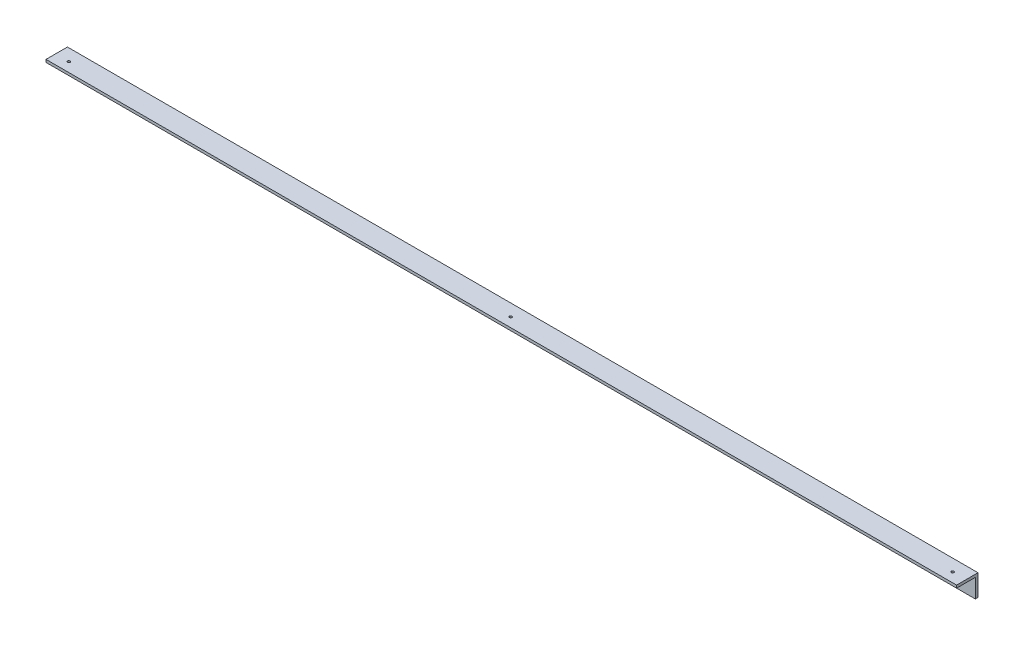
ISO-10303-21;
HEADER;
FILE_DESCRIPTION(('STEP AP214'),'2;1');
FILE_NAME('part.step','',(''),(''),'','','');
FILE_SCHEMA(('AUTOMOTIVE_DESIGN { 1 0 10303 214 1 1 1 1 }'));
ENDSEC;
DATA;
#1=APPLICATION_CONTEXT('core data for automotive mechanical design processes');
#2=APPLICATION_PROTOCOL_DEFINITION('international standard','automotive_design',2000,#1);
#3=PRODUCT_CONTEXT('',#1,'mechanical');
#4=PRODUCT('Part','Part','',(#3));
#5=PRODUCT_RELATED_PRODUCT_CATEGORY('part','',(#4));
#6=PRODUCT_DEFINITION_FORMATION('','',#4);
#7=PRODUCT_DEFINITION_CONTEXT('part definition',#1,'design');
#8=PRODUCT_DEFINITION('design','',#6,#7);
#9=PRODUCT_DEFINITION_SHAPE('','',#8);
#10=(LENGTH_UNIT() NAMED_UNIT(*) SI_UNIT(.MILLI.,.METRE.));
#11=(NAMED_UNIT(*) PLANE_ANGLE_UNIT() SI_UNIT($,.RADIAN.));
#12=(NAMED_UNIT(*) SI_UNIT($,.STERADIAN.) SOLID_ANGLE_UNIT());
#13=UNCERTAINTY_MEASURE_WITH_UNIT(LENGTH_MEASURE(1.E-05),#10,'distance_accuracy_value','');
#14=(GEOMETRIC_REPRESENTATION_CONTEXT(3) GLOBAL_UNCERTAINTY_ASSIGNED_CONTEXT((#13)) GLOBAL_UNIT_ASSIGNED_CONTEXT((#10,
#11,#12)) REPRESENTATION_CONTEXT('',''));
#15=CARTESIAN_POINT('',(0.,0.,0.));
#16=DIRECTION('',(0.,0.,1.));
#17=DIRECTION('',(1.,0.,0.));
#18=AXIS2_PLACEMENT_3D('',#15,#16,#17);
#19=CARTESIAN_POINT('',(0.,-40.,10.));
#20=DIRECTION('',(0.,1.,0.));
#21=DIRECTION('',(0.,0.,1.));
#22=AXIS2_PLACEMENT_3D('',#19,#20,#21);
#23=PLANE('',#22);
#24=DIRECTION('',(1.,0.,0.));
#25=VECTOR('',#24,1.);
#26=CARTESIAN_POINT('',(0.,-40.,0.));
#27=LINE('',#26,#25);
#28=CARTESIAN_POINT('',(-50.,-40.,0.));
#29=VERTEX_POINT('',#28);
#30=CARTESIAN_POINT('',(3350.,-40.,0.));
#31=VERTEX_POINT('',#30);
#32=EDGE_CURVE('E91',#29,#31,#27,.T.);
#33=ORIENTED_EDGE('',*,*,#32,.T.);
#34=DIRECTION('',(0.,0.,-1.));
#35=VECTOR('',#34,1.);
#36=CARTESIAN_POINT('',(3350.,-40.,10.));
#37=LINE('',#36,#35);
#38=CARTESIAN_POINT('',(3350.,-40.,10.));
#39=VERTEX_POINT('',#38);
#40=EDGE_CURVE('E11',#39,#31,#37,.T.);
#41=ORIENTED_EDGE('',*,*,#40,.F.);
#42=DIRECTION('',(1.,0.,0.));
#43=VECTOR('',#42,1.);
#44=CARTESIAN_POINT('',(0.,-40.,10.));
#45=LINE('',#44,#43);
#46=CARTESIAN_POINT('',(-50.,-40.,10.));
#47=VERTEX_POINT('',#46);
#48=EDGE_CURVE('E92',#47,#39,#45,.T.);
#49=ORIENTED_EDGE('',*,*,#48,.F.);
#50=DIRECTION('',(0.,0.,-1.));
#51=VECTOR('',#50,1.);
#52=CARTESIAN_POINT('',(-50.,-40.,10.));
#53=LINE('',#52,#51);
#54=EDGE_CURVE('E77',#47,#29,#53,.T.);
#55=ORIENTED_EDGE('',*,*,#54,.T.);
#56=EDGE_LOOP('',(#33,#41,#49,#55));
#57=FACE_BOUND('',#56,.T.);
#58=ADVANCED_FACE('F35',(#57),#23,.F.);
#59=CARTESIAN_POINT('',(3350.,0.,10.));
#60=DIRECTION('',(-1.,0.,0.));
#61=DIRECTION('',(0.,0.,1.));
#62=AXIS2_PLACEMENT_3D('',#59,#60,#61);
#63=PLANE('',#62);
#64=DIRECTION('',(0.,1.,0.));
#65=VECTOR('',#64,1.);
#66=CARTESIAN_POINT('',(3350.,0.,0.));
#67=LINE('',#66,#65);
#68=CARTESIAN_POINT('',(3350.,40.0000000000004,0.));
#69=VERTEX_POINT('',#68);
#70=EDGE_CURVE('E97',#31,#69,#67,.T.);
#71=ORIENTED_EDGE('',*,*,#70,.T.);
#72=DIRECTION('',(0.,0.,-1.));
#73=VECTOR('',#72,1.);
#74=CARTESIAN_POINT('',(3350.,40.0000000000004,10.));
#75=LINE('',#74,#73);
#76=CARTESIAN_POINT('',(3350.,40.0000000000004,80.));
#77=VERTEX_POINT('',#76);
#78=EDGE_CURVE('E42',#77,#69,#75,.T.);
#79=ORIENTED_EDGE('',*,*,#78,.F.);
#80=DIRECTION('',(0.,1.,0.));
#81=VECTOR('',#80,1.);
#82=CARTESIAN_POINT('',(3350.,30.,80.));
#83=LINE('',#82,#81);
#84=CARTESIAN_POINT('',(3350.,30.,80.));
#85=VERTEX_POINT('',#84);
#86=EDGE_CURVE('E129',#85,#77,#83,.T.);
#87=ORIENTED_EDGE('',*,*,#86,.F.);
#88=DIRECTION('',(0.,0.,-1.));
#89=VECTOR('',#88,1.);
#90=CARTESIAN_POINT('',(3350.,30.,80.));
#91=LINE('',#90,#89);
#92=CARTESIAN_POINT('',(3350.,30.,10.));
#93=VERTEX_POINT('',#92);
#94=EDGE_CURVE('E102',#85,#93,#91,.T.);
#95=ORIENTED_EDGE('',*,*,#94,.T.);
#96=DIRECTION('',(0.,1.,0.));
#97=VECTOR('',#96,1.);
#98=CARTESIAN_POINT('',(3350.,0.,10.));
#99=LINE('',#98,#97);
#100=EDGE_CURVE('E148',#39,#93,#99,.T.);
#101=ORIENTED_EDGE('',*,*,#100,.F.);
#102=ORIENTED_EDGE('',*,*,#40,.T.);
#103=EDGE_LOOP('',(#71,#79,#87,#95,#101,#102));
#104=FACE_BOUND('',#103,.T.);
#105=ADVANCED_FACE('F126',(#104),#63,.F.);
#106=CARTESIAN_POINT('',(0.,40.,10.));
#107=DIRECTION('',(0.,-1.,0.));
#108=DIRECTION('',(1.,0.,0.));
#109=AXIS2_PLACEMENT_3D('',#106,#107,#108);
#110=PLANE('',#109);
#111=CARTESIAN_POINT('',(3300.,40.0000000000004,45.));
#112=DIRECTION('',(0.,-1.,0.));
#113=DIRECTION('',(1.,0.,0.));
#114=AXIS2_PLACEMENT_3D('',#111,#112,#113);
#115=CIRCLE('',#114,4.76250000000012);
#116=CARTESIAN_POINT('',(3304.7625,40.0000000000004,45.));
#117=VERTEX_POINT('',#116);
#118=EDGE_CURVE('E145',#117,#117,#115,.T.);
#119=ORIENTED_EDGE('',*,*,#118,.T.);
#120=EDGE_LOOP('',(#119));
#121=FACE_BOUND('',#120,.T.);
#122=CARTESIAN_POINT('',(1650.,40.0000000000004,45.));
#123=DIRECTION('',(0.,-1.,0.));
#124=DIRECTION('',(1.,0.,0.));
#125=AXIS2_PLACEMENT_3D('',#122,#123,#124);
#126=CIRCLE('',#125,4.76249999999991);
#127=CARTESIAN_POINT('',(1654.7625,40.0000000000004,45.));
#128=VERTEX_POINT('',#127);
#129=EDGE_CURVE('E298',#128,#128,#126,.T.);
#130=ORIENTED_EDGE('',*,*,#129,.T.);
#131=EDGE_LOOP('',(#130));
#132=FACE_BOUND('',#131,.T.);
#133=CARTESIAN_POINT('',(0.,40.0000000000004,45.));
#134=DIRECTION('',(0.,-1.,0.));
#135=DIRECTION('',(1.,0.,0.));
#136=AXIS2_PLACEMENT_3D('',#133,#134,#135);
#137=CIRCLE('',#136,4.7625);
#138=CARTESIAN_POINT('',(4.7625,40.0000000000004,45.));
#139=VERTEX_POINT('',#138);
#140=EDGE_CURVE('E307',#139,#139,#137,.T.);
#141=ORIENTED_EDGE('',*,*,#140,.T.);
#142=EDGE_LOOP('',(#141));
#143=FACE_BOUND('',#142,.T.);
#144=DIRECTION('',(-1.,0.,0.));
#145=VECTOR('',#144,1.);
#146=CARTESIAN_POINT('',(0.,40.,0.));
#147=LINE('',#146,#145);
#148=CARTESIAN_POINT('',(-50.,40.,0.));
#149=VERTEX_POINT('',#148);
#150=EDGE_CURVE('E86',#69,#149,#147,.T.);
#151=ORIENTED_EDGE('',*,*,#150,.T.);
#152=DIRECTION('',(0.,0.,-1.));
#153=VECTOR('',#152,1.);
#154=CARTESIAN_POINT('',(-50.,40.,10.));
#155=LINE('',#154,#153);
#156=CARTESIAN_POINT('',(-50.,40.,80.));
#157=VERTEX_POINT('',#156);
#158=EDGE_CURVE('E81',#157,#149,#155,.T.);
#159=ORIENTED_EDGE('',*,*,#158,.F.);
#160=DIRECTION('',(-1.,0.,0.));
#161=VECTOR('',#160,1.);
#162=CARTESIAN_POINT('',(3350.,40.0000000000004,80.));
#163=LINE('',#162,#161);
#164=EDGE_CURVE('E122',#77,#157,#163,.T.);
#165=ORIENTED_EDGE('',*,*,#164,.F.);
#166=ORIENTED_EDGE('',*,*,#78,.T.);
#167=EDGE_LOOP('',(#151,#159,#165,#166));
#168=FACE_BOUND('',#167,.T.);
#169=ADVANCED_FACE('F120',(#121,#132,#143,#168),#110,.F.);
#170=CARTESIAN_POINT('',(0.,0.,10.));
#171=DIRECTION('',(0.,0.,-1.));
#172=DIRECTION('',(-1.,0.,0.));
#173=AXIS2_PLACEMENT_3D('',#170,#171,#172);
#174=CYLINDRICAL_SURFACE('',#173,4.7625);
#175=CARTESIAN_POINT('',(0.,0.,10.));
#176=DIRECTION('',(0.,0.,1.));
#177=DIRECTION('',(1.,0.,0.));
#178=AXIS2_PLACEMENT_3D('',#175,#176,#177);
#179=CIRCLE('',#178,4.7625);
#180=CARTESIAN_POINT('',(4.7625,0.,10.));
#181=VERTEX_POINT('',#180);
#182=EDGE_CURVE('E153',#181,#181,#179,.T.);
#183=ORIENTED_EDGE('',*,*,#182,.T.);
#184=EDGE_LOOP('',(#183));
#185=FACE_BOUND('',#184,.T.);
#186=CARTESIAN_POINT('',(0.,0.,0.));
#187=DIRECTION('',(0.,0.,1.));
#188=DIRECTION('',(1.,0.,0.));
#189=AXIS2_PLACEMENT_3D('',#186,#187,#188);
#190=CIRCLE('',#189,4.7625);
#191=CARTESIAN_POINT('',(4.7625,0.,0.));
#192=VERTEX_POINT('',#191);
#193=EDGE_CURVE('E110',#192,#192,#190,.T.);
#194=ORIENTED_EDGE('',*,*,#193,.F.);
#195=EDGE_LOOP('',(#194));
#196=FACE_BOUND('',#195,.T.);
#197=ADVANCED_FACE('F182',(#185,#196),#174,.F.);
#198=CARTESIAN_POINT('',(3300.,0.,10.));
#199=DIRECTION('',(0.,0.,-1.));
#200=DIRECTION('',(-1.,0.,0.));
#201=AXIS2_PLACEMENT_3D('',#198,#199,#200);
#202=CYLINDRICAL_SURFACE('',#201,4.765);
#203=CARTESIAN_POINT('',(3300.,0.,10.));
#204=DIRECTION('',(0.,0.,1.));
#205=DIRECTION('',(1.,0.,0.));
#206=AXIS2_PLACEMENT_3D('',#203,#204,#205);
#207=CIRCLE('',#206,4.765);
#208=CARTESIAN_POINT('',(3304.765,0.,10.));
#209=VERTEX_POINT('',#208);
#210=EDGE_CURVE('E151',#209,#209,#207,.T.);
#211=ORIENTED_EDGE('',*,*,#210,.T.);
#212=EDGE_LOOP('',(#211));
#213=FACE_BOUND('',#212,.T.);
#214=CARTESIAN_POINT('',(3300.,0.,0.));
#215=DIRECTION('',(0.,0.,1.));
#216=DIRECTION('',(1.,0.,0.));
#217=AXIS2_PLACEMENT_3D('',#214,#215,#216);
#218=CIRCLE('',#217,4.765);
#219=CARTESIAN_POINT('',(3304.765,0.,0.));
#220=VERTEX_POINT('',#219);
#221=EDGE_CURVE('E85',#220,#220,#218,.T.);
#222=ORIENTED_EDGE('',*,*,#221,.F.);
#223=EDGE_LOOP('',(#222));
#224=FACE_BOUND('',#223,.T.);
#225=ADVANCED_FACE('F188',(#213,#224),#202,.F.);
#226=CARTESIAN_POINT('',(-50.,0.,10.));
#227=DIRECTION('',(1.,0.,0.));
#228=DIRECTION('',(0.,0.,-1.));
#229=AXIS2_PLACEMENT_3D('',#226,#227,#228);
#230=PLANE('',#229);
#231=DIRECTION('',(0.,-1.,0.));
#232=VECTOR('',#231,1.);
#233=CARTESIAN_POINT('',(-50.,0.,0.));
#234=LINE('',#233,#232);
#235=EDGE_CURVE('E74',#149,#29,#234,.T.);
#236=ORIENTED_EDGE('',*,*,#235,.T.);
#237=ORIENTED_EDGE('',*,*,#54,.F.);
#238=DIRECTION('',(0.,-1.,0.));
#239=VECTOR('',#238,1.);
#240=CARTESIAN_POINT('',(-50.,0.,10.));
#241=LINE('',#240,#239);
#242=CARTESIAN_POINT('',(-50.,30.,10.));
#243=VERTEX_POINT('',#242);
#244=EDGE_CURVE('E54',#243,#47,#241,.T.);
#245=ORIENTED_EDGE('',*,*,#244,.F.);
#246=DIRECTION('',(0.,0.,-1.));
#247=VECTOR('',#246,1.);
#248=CARTESIAN_POINT('',(-50.,30.,80.));
#249=LINE('',#248,#247);
#250=CARTESIAN_POINT('',(-50.,30.,80.));
#251=VERTEX_POINT('',#250);
#252=EDGE_CURVE('E98',#251,#243,#249,.T.);
#253=ORIENTED_EDGE('',*,*,#252,.F.);
#254=DIRECTION('',(0.,-1.,0.));
#255=VECTOR('',#254,1.);
#256=CARTESIAN_POINT('',(-50.,40.,80.));
#257=LINE('',#256,#255);
#258=EDGE_CURVE('E141',#157,#251,#257,.T.);
#259=ORIENTED_EDGE('',*,*,#258,.F.);
#260=ORIENTED_EDGE('',*,*,#158,.T.);
#261=EDGE_LOOP('',(#236,#237,#245,#253,#259,#260));
#262=FACE_BOUND('',#261,.T.);
#263=ADVANCED_FACE('F76',(#262),#230,.F.);
#264=CARTESIAN_POINT('',(1650.,0.,10.));
#265=DIRECTION('',(0.,0.,-1.));
#266=DIRECTION('',(-1.,0.,0.));
#267=AXIS2_PLACEMENT_3D('',#264,#265,#266);
#268=CYLINDRICAL_SURFACE('',#267,4.765);
#269=CARTESIAN_POINT('',(1650.,0.,10.));
#270=DIRECTION('',(0.,0.,1.));
#271=DIRECTION('',(1.,0.,0.));
#272=AXIS2_PLACEMENT_3D('',#269,#270,#271);
#273=CIRCLE('',#272,4.765);
#274=CARTESIAN_POINT('',(1654.765,0.,10.));
#275=VERTEX_POINT('',#274);
#276=EDGE_CURVE('E93',#275,#275,#273,.T.);
#277=ORIENTED_EDGE('',*,*,#276,.T.);
#278=EDGE_LOOP('',(#277));
#279=FACE_BOUND('',#278,.T.);
#280=CARTESIAN_POINT('',(1650.,0.,0.));
#281=DIRECTION('',(0.,0.,1.));
#282=DIRECTION('',(1.,0.,0.));
#283=AXIS2_PLACEMENT_3D('',#280,#281,#282);
#284=CIRCLE('',#283,4.765);
#285=CARTESIAN_POINT('',(1654.765,0.,0.));
#286=VERTEX_POINT('',#285);
#287=EDGE_CURVE('E113',#286,#286,#284,.T.);
#288=ORIENTED_EDGE('',*,*,#287,.F.);
#289=EDGE_LOOP('',(#288));
#290=FACE_BOUND('',#289,.T.);
#291=ADVANCED_FACE('F160',(#279,#290),#268,.F.);
#292=CARTESIAN_POINT('',(0.,0.,10.));
#293=DIRECTION('',(0.,0.,1.));
#294=DIRECTION('',(1.,0.,0.));
#295=AXIS2_PLACEMENT_3D('',#292,#293,#294);
#296=PLANE('',#295);
#297=DIRECTION('',(1.,0.,0.));
#298=VECTOR('',#297,1.);
#299=CARTESIAN_POINT('',(-50.,30.,10.));
#300=LINE('',#299,#298);
#301=EDGE_CURVE('E49',#243,#93,#300,.T.);
#302=ORIENTED_EDGE('',*,*,#301,.F.);
#303=ORIENTED_EDGE('',*,*,#244,.T.);
#304=ORIENTED_EDGE('',*,*,#48,.T.);
#305=ORIENTED_EDGE('',*,*,#100,.T.);
#306=EDGE_LOOP('',(#302,#303,#304,#305));
#307=FACE_BOUND('',#306,.T.);
#308=ORIENTED_EDGE('',*,*,#210,.F.);
#309=EDGE_LOOP('',(#308));
#310=FACE_BOUND('',#309,.T.);
#311=ORIENTED_EDGE('',*,*,#182,.F.);
#312=EDGE_LOOP('',(#311));
#313=FACE_BOUND('',#312,.T.);
#314=ORIENTED_EDGE('',*,*,#276,.F.);
#315=EDGE_LOOP('',(#314));
#316=FACE_BOUND('',#315,.T.);
#317=ADVANCED_FACE('F163',(#307,#310,#313,#316),#296,.T.);
#318=CARTESIAN_POINT('',(0.,0.,0.));
#319=DIRECTION('',(0.,0.,1.));
#320=DIRECTION('',(1.,0.,0.));
#321=AXIS2_PLACEMENT_3D('',#318,#319,#320);
#322=PLANE('',#321);
#323=ORIENTED_EDGE('',*,*,#32,.F.);
#324=ORIENTED_EDGE('',*,*,#235,.F.);
#325=ORIENTED_EDGE('',*,*,#150,.F.);
#326=ORIENTED_EDGE('',*,*,#70,.F.);
#327=EDGE_LOOP('',(#323,#324,#325,#326));
#328=FACE_BOUND('',#327,.T.);
#329=ORIENTED_EDGE('',*,*,#221,.T.);
#330=EDGE_LOOP('',(#329));
#331=FACE_BOUND('',#330,.T.);
#332=ORIENTED_EDGE('',*,*,#193,.T.);
#333=EDGE_LOOP('',(#332));
#334=FACE_BOUND('',#333,.T.);
#335=ORIENTED_EDGE('',*,*,#287,.T.);
#336=EDGE_LOOP('',(#335));
#337=FACE_BOUND('',#336,.T.);
#338=ADVANCED_FACE('F95',(#328,#331,#334,#337),#322,.F.);
#339=CARTESIAN_POINT('',(-50.,30.,80.));
#340=DIRECTION('',(0.,1.,0.));
#341=DIRECTION('',(-1.,0.,0.));
#342=AXIS2_PLACEMENT_3D('',#339,#340,#341);
#343=PLANE('',#342);
#344=CARTESIAN_POINT('',(3300.,30.,45.));
#345=DIRECTION('',(0.,-1.,0.));
#346=DIRECTION('',(1.,0.,0.));
#347=AXIS2_PLACEMENT_3D('',#344,#345,#346);
#348=CIRCLE('',#347,4.76250000000012);
#349=CARTESIAN_POINT('',(3304.7625,30.,45.));
#350=VERTEX_POINT('',#349);
#351=EDGE_CURVE('E297',#350,#350,#348,.T.);
#352=ORIENTED_EDGE('',*,*,#351,.F.);
#353=EDGE_LOOP('',(#352));
#354=FACE_BOUND('',#353,.T.);
#355=CARTESIAN_POINT('',(1650.,30.,45.));
#356=DIRECTION('',(0.,-1.,0.));
#357=DIRECTION('',(1.,0.,0.));
#358=AXIS2_PLACEMENT_3D('',#355,#356,#357);
#359=CIRCLE('',#358,4.76249999999991);
#360=CARTESIAN_POINT('',(1654.7625,30.,45.));
#361=VERTEX_POINT('',#360);
#362=EDGE_CURVE('E302',#361,#361,#359,.T.);
#363=ORIENTED_EDGE('',*,*,#362,.F.);
#364=EDGE_LOOP('',(#363));
#365=FACE_BOUND('',#364,.T.);
#366=CARTESIAN_POINT('',(0.,30.,45.));
#367=DIRECTION('',(0.,-1.,0.));
#368=DIRECTION('',(1.,0.,0.));
#369=AXIS2_PLACEMENT_3D('',#366,#367,#368);
#370=CIRCLE('',#369,4.7625);
#371=CARTESIAN_POINT('',(4.7625,30.,45.));
#372=VERTEX_POINT('',#371);
#373=EDGE_CURVE('E310',#372,#372,#370,.T.);
#374=ORIENTED_EDGE('',*,*,#373,.F.);
#375=EDGE_LOOP('',(#374));
#376=FACE_BOUND('',#375,.T.);
#377=ORIENTED_EDGE('',*,*,#301,.T.);
#378=ORIENTED_EDGE('',*,*,#94,.F.);
#379=DIRECTION('',(1.,0.,0.));
#380=VECTOR('',#379,1.);
#381=CARTESIAN_POINT('',(-50.,30.,80.));
#382=LINE('',#381,#380);
#383=EDGE_CURVE('E137',#251,#85,#382,.T.);
#384=ORIENTED_EDGE('',*,*,#383,.F.);
#385=ORIENTED_EDGE('',*,*,#252,.T.);
#386=EDGE_LOOP('',(#377,#378,#384,#385));
#387=FACE_BOUND('',#386,.T.);
#388=ADVANCED_FACE('F170',(#354,#365,#376,#387),#343,.F.);
#389=CARTESIAN_POINT('',(0.,0.,80.));
#390=DIRECTION('',(0.,0.,1.));
#391=DIRECTION('',(1.,0.,0.));
#392=AXIS2_PLACEMENT_3D('',#389,#390,#391);
#393=PLANE('',#392);
#394=ORIENTED_EDGE('',*,*,#164,.T.);
#395=ORIENTED_EDGE('',*,*,#258,.T.);
#396=ORIENTED_EDGE('',*,*,#383,.T.);
#397=ORIENTED_EDGE('',*,*,#86,.T.);
#398=EDGE_LOOP('',(#394,#395,#396,#397));
#399=FACE_BOUND('',#398,.T.);
#400=ADVANCED_FACE('F133',(#399),#393,.T.);
#401=CARTESIAN_POINT('',(0.,40.0000000000004,45.));
#402=DIRECTION('',(0.,-1.,0.));
#403=DIRECTION('',(1.,0.,0.));
#404=AXIS2_PLACEMENT_3D('',#401,#402,#403);
#405=CYLINDRICAL_SURFACE('',#404,4.7625);
#406=ORIENTED_EDGE('',*,*,#140,.F.);
#407=EDGE_LOOP('',(#406));
#408=FACE_BOUND('',#407,.T.);
#409=ORIENTED_EDGE('',*,*,#373,.T.);
#410=EDGE_LOOP('',(#409));
#411=FACE_BOUND('',#410,.T.);
#412=ADVANCED_FACE('F260',(#408,#411),#405,.F.);
#413=CARTESIAN_POINT('',(1650.,40.0000000000004,45.));
#414=DIRECTION('',(0.,-1.,0.));
#415=DIRECTION('',(1.,0.,0.));
#416=AXIS2_PLACEMENT_3D('',#413,#414,#415);
#417=CYLINDRICAL_SURFACE('',#416,4.76249999999991);
#418=ORIENTED_EDGE('',*,*,#129,.F.);
#419=EDGE_LOOP('',(#418));
#420=FACE_BOUND('',#419,.T.);
#421=ORIENTED_EDGE('',*,*,#362,.T.);
#422=EDGE_LOOP('',(#421));
#423=FACE_BOUND('',#422,.T.);
#424=ADVANCED_FACE('F267',(#420,#423),#417,.F.);
#425=CARTESIAN_POINT('',(3300.,40.0000000000004,45.));
#426=DIRECTION('',(0.,-1.,0.));
#427=DIRECTION('',(1.,0.,0.));
#428=AXIS2_PLACEMENT_3D('',#425,#426,#427);
#429=CYLINDRICAL_SURFACE('',#428,4.76250000000012);
#430=ORIENTED_EDGE('',*,*,#118,.F.);
#431=EDGE_LOOP('',(#430));
#432=FACE_BOUND('',#431,.T.);
#433=ORIENTED_EDGE('',*,*,#351,.T.);
#434=EDGE_LOOP('',(#433));
#435=FACE_BOUND('',#434,.T.);
#436=ADVANCED_FACE('F276',(#432,#435),#429,.F.);
#437=CLOSED_SHELL('',(#58,#105,#169,#197,#225,#263,#291,#317,#338,#388,#400,#412,#424,#436));
#438=MANIFOLD_SOLID_BREP('B2',#437);
#439=ADVANCED_BREP_SHAPE_REPRESENTATION('',(#18,#438),#14);
#440=SHAPE_DEFINITION_REPRESENTATION(#9,#439);
ENDSEC;
END-ISO-10303-21;
